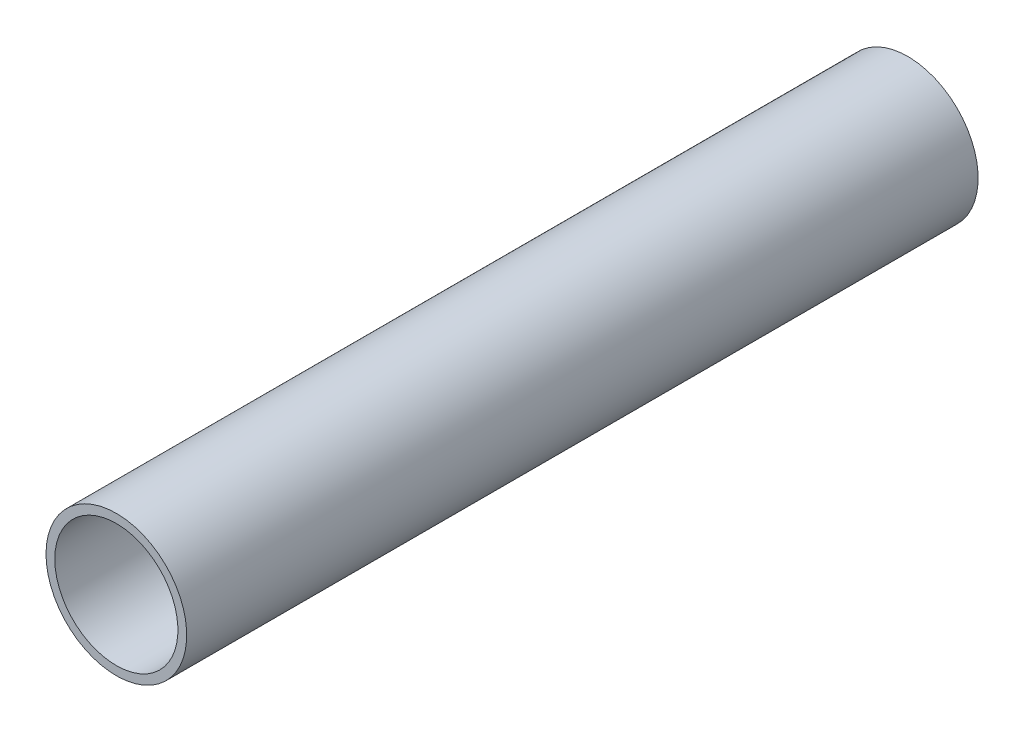
ISO-10303-21;
HEADER;
FILE_DESCRIPTION(('STEP AP214'),'2;1');
FILE_NAME('part.step','',(''),(''),'','','');
FILE_SCHEMA(('AUTOMOTIVE_DESIGN { 1 0 10303 214 1 1 1 1 }'));
ENDSEC;
DATA;
#1=APPLICATION_CONTEXT('core data for automotive mechanical design processes');
#2=APPLICATION_PROTOCOL_DEFINITION('international standard','automotive_design',2000,#1);
#3=PRODUCT_CONTEXT('',#1,'mechanical');
#4=PRODUCT('Part','Part','',(#3));
#5=PRODUCT_RELATED_PRODUCT_CATEGORY('part','',(#4));
#6=PRODUCT_DEFINITION_FORMATION('','',#4);
#7=PRODUCT_DEFINITION_CONTEXT('part definition',#1,'design');
#8=PRODUCT_DEFINITION('design','',#6,#7);
#9=PRODUCT_DEFINITION_SHAPE('','',#8);
#10=(LENGTH_UNIT() NAMED_UNIT(*) SI_UNIT(.MILLI.,.METRE.));
#11=(NAMED_UNIT(*) PLANE_ANGLE_UNIT() SI_UNIT($,.RADIAN.));
#12=(NAMED_UNIT(*) SI_UNIT($,.STERADIAN.) SOLID_ANGLE_UNIT());
#13=UNCERTAINTY_MEASURE_WITH_UNIT(LENGTH_MEASURE(1.E-05),#10,'distance_accuracy_value','');
#14=(GEOMETRIC_REPRESENTATION_CONTEXT(3) GLOBAL_UNCERTAINTY_ASSIGNED_CONTEXT((#13)) GLOBAL_UNIT_ASSIGNED_CONTEXT((#10,
#11,#12)) REPRESENTATION_CONTEXT('',''));
#15=CARTESIAN_POINT('',(0.,0.,0.));
#16=DIRECTION('',(0.,0.,1.));
#17=DIRECTION('',(1.,0.,0.));
#18=AXIS2_PLACEMENT_3D('',#15,#16,#17);
#19=CARTESIAN_POINT('',(0.,0.,90.));
#20=DIRECTION('',(0.,0.,1.));
#21=DIRECTION('',(1.,0.,0.));
#22=AXIS2_PLACEMENT_3D('',#19,#20,#21);
#23=PLANE('',#22);
#24=CARTESIAN_POINT('',(0.,0.,90.));
#25=DIRECTION('',(0.,0.,1.));
#26=DIRECTION('',(1.,0.,0.));
#27=AXIS2_PLACEMENT_3D('',#24,#25,#26);
#28=CIRCLE('',#27,8.);
#29=CARTESIAN_POINT('',(-8.,0.,90.));
#30=VERTEX_POINT('',#29);
#31=EDGE_CURVE('E10',#30,#30,#28,.T.);
#32=ORIENTED_EDGE('',*,*,#31,.T.);
#33=EDGE_LOOP('',(#32));
#34=FACE_BOUND('',#33,.T.);
#35=CARTESIAN_POINT('',(0.,0.,90.));
#36=DIRECTION('',(0.,0.,1.));
#37=DIRECTION('',(1.,0.,0.));
#38=AXIS2_PLACEMENT_3D('',#35,#36,#37);
#39=CIRCLE('',#38,7.);
#40=CARTESIAN_POINT('',(-7.,0.,90.));
#41=VERTEX_POINT('',#40);
#42=EDGE_CURVE('E50',#41,#41,#39,.T.);
#43=ORIENTED_EDGE('',*,*,#42,.F.);
#44=EDGE_LOOP('',(#43));
#45=FACE_BOUND('',#44,.T.);
#46=ADVANCED_FACE('F39',(#34,#45),#23,.T.);
#47=CARTESIAN_POINT('',(0.,0.,0.));
#48=DIRECTION('',(0.,0.,1.));
#49=DIRECTION('',(1.,0.,0.));
#50=AXIS2_PLACEMENT_3D('',#47,#48,#49);
#51=PLANE('',#50);
#52=CARTESIAN_POINT('',(0.,0.,0.));
#53=DIRECTION('',(0.,0.,1.));
#54=DIRECTION('',(1.,0.,0.));
#55=AXIS2_PLACEMENT_3D('',#52,#53,#54);
#56=CIRCLE('',#55,8.);
#57=CARTESIAN_POINT('',(-8.,0.,0.));
#58=VERTEX_POINT('',#57);
#59=EDGE_CURVE('E43',#58,#58,#56,.T.);
#60=ORIENTED_EDGE('',*,*,#59,.F.);
#61=EDGE_LOOP('',(#60));
#62=FACE_BOUND('',#61,.T.);
#63=CARTESIAN_POINT('',(0.,0.,0.));
#64=DIRECTION('',(0.,0.,1.));
#65=DIRECTION('',(1.,0.,0.));
#66=AXIS2_PLACEMENT_3D('',#63,#64,#65);
#67=CIRCLE('',#66,7.);
#68=CARTESIAN_POINT('',(-7.,0.,0.));
#69=VERTEX_POINT('',#68);
#70=EDGE_CURVE('E52',#69,#69,#67,.T.);
#71=ORIENTED_EDGE('',*,*,#70,.T.);
#72=EDGE_LOOP('',(#71));
#73=FACE_BOUND('',#72,.T.);
#74=ADVANCED_FACE('F62',(#62,#73),#51,.F.);
#75=CARTESIAN_POINT('',(0.,0.,90.));
#76=DIRECTION('',(0.,0.,-1.));
#77=DIRECTION('',(-1.,0.,0.));
#78=AXIS2_PLACEMENT_3D('',#75,#76,#77);
#79=CYLINDRICAL_SURFACE('',#78,8.);
#80=CARTESIAN_POINT('',(-8.,0.,90.));
#81=CARTESIAN_POINT('',(-8.,0.,89.0625));
#82=CARTESIAN_POINT('',(-8.,0.,88.125));
#83=CARTESIAN_POINT('',(-8.,0.,86.25));
#84=CARTESIAN_POINT('',(-8.,0.,85.3125));
#85=CARTESIAN_POINT('',(-8.,0.,83.4375));
#86=CARTESIAN_POINT('',(-8.,0.,82.5));
#87=CARTESIAN_POINT('',(-8.,0.,80.625));
#88=CARTESIAN_POINT('',(-8.,0.,79.6875));
#89=CARTESIAN_POINT('',(-8.,0.,77.8125));
#90=CARTESIAN_POINT('',(-8.,0.,76.875));
#91=CARTESIAN_POINT('',(-8.,0.,75.));
#92=CARTESIAN_POINT('',(-8.,0.,74.0625));
#93=CARTESIAN_POINT('',(-8.,0.,72.1875));
#94=CARTESIAN_POINT('',(-8.,0.,71.25));
#95=CARTESIAN_POINT('',(-8.,0.,69.375));
#96=CARTESIAN_POINT('',(-8.,0.,68.4375));
#97=CARTESIAN_POINT('',(-8.,0.,66.5625));
#98=CARTESIAN_POINT('',(-8.,0.,65.625));
#99=CARTESIAN_POINT('',(-8.,0.,63.75));
#100=CARTESIAN_POINT('',(-8.,0.,62.8125));
#101=CARTESIAN_POINT('',(-8.,0.,60.9375));
#102=CARTESIAN_POINT('',(-8.,0.,60.));
#103=CARTESIAN_POINT('',(-8.,0.,58.125));
#104=CARTESIAN_POINT('',(-8.,0.,57.1875));
#105=CARTESIAN_POINT('',(-8.,0.,55.3125));
#106=CARTESIAN_POINT('',(-8.,0.,54.375));
#107=CARTESIAN_POINT('',(-8.,0.,52.5));
#108=CARTESIAN_POINT('',(-8.,0.,51.5625));
#109=CARTESIAN_POINT('',(-8.,0.,49.6875));
#110=CARTESIAN_POINT('',(-8.,0.,48.75));
#111=CARTESIAN_POINT('',(-8.,0.,46.875));
#112=CARTESIAN_POINT('',(-8.,0.,45.9375));
#113=CARTESIAN_POINT('',(-8.,0.,44.0625));
#114=CARTESIAN_POINT('',(-8.,0.,43.125));
#115=CARTESIAN_POINT('',(-8.,0.,41.25));
#116=CARTESIAN_POINT('',(-8.,0.,40.3125));
#117=CARTESIAN_POINT('',(-8.,0.,38.4375));
#118=CARTESIAN_POINT('',(-8.,0.,37.5));
#119=CARTESIAN_POINT('',(-8.,0.,35.625));
#120=CARTESIAN_POINT('',(-8.,0.,34.6875));
#121=CARTESIAN_POINT('',(-8.,0.,32.8125));
#122=CARTESIAN_POINT('',(-8.,0.,31.875));
#123=CARTESIAN_POINT('',(-8.,0.,30.));
#124=CARTESIAN_POINT('',(-8.,0.,29.0625));
#125=CARTESIAN_POINT('',(-8.,0.,27.1875));
#126=CARTESIAN_POINT('',(-8.,0.,26.25));
#127=CARTESIAN_POINT('',(-8.,0.,24.375));
#128=CARTESIAN_POINT('',(-8.,0.,23.4375));
#129=CARTESIAN_POINT('',(-8.,0.,21.5625));
#130=CARTESIAN_POINT('',(-8.,0.,20.625));
#131=CARTESIAN_POINT('',(-8.,0.,18.75));
#132=CARTESIAN_POINT('',(-8.,0.,17.8125));
#133=CARTESIAN_POINT('',(-8.,0.,15.9375));
#134=CARTESIAN_POINT('',(-8.,0.,15.));
#135=CARTESIAN_POINT('',(-8.,0.,13.125));
#136=CARTESIAN_POINT('',(-8.,0.,12.1875));
#137=CARTESIAN_POINT('',(-8.,0.,10.3125));
#138=CARTESIAN_POINT('',(-8.,0.,9.37499999999999));
#139=CARTESIAN_POINT('',(-8.,0.,7.49999999999999));
#140=CARTESIAN_POINT('',(-8.,0.,6.56249999999999));
#141=CARTESIAN_POINT('',(-8.,0.,4.68749999999999));
#142=CARTESIAN_POINT('',(-8.,0.,3.74999999999998));
#143=CARTESIAN_POINT('',(-8.,0.,1.87499999999998));
#144=CARTESIAN_POINT('',(-8.,0.,0.937499999999986));
#145=CARTESIAN_POINT('',(-8.,0.,0.));
#146=B_SPLINE_CURVE_WITH_KNOTS('',3,(#80,#81,#82,#83,#84,#85,#86,#87,#88,#89,#90,#91,#92,#93,
#94,#95,#96,#97,#98,#99,#100,#101,#102,#103,#104,#105,#106,#107,#108,#109,#110,#111,#112,#113,
#114,#115,#116,#117,#118,#119,#120,#121,#122,#123,#124,#125,#126,#127,#128,#129,#130,#131,#132,
#133,#134,#135,#136,#137,#138,#139,#140,#141,#142,#143,#144,#145),.UNSPECIFIED.,.F.,.F.,(4,2,2,
2,2,2,2,2,2,2,2,2,2,2,2,2,2,2,2,2,2,2,2,2,2,2,2,2,2,2,2,2,4),(0.,2.8125,5.62499999999999,
8.43749999999999,11.25,14.0625,16.875,19.6875,22.5,25.3125,28.125,30.9375,33.75,36.5625,39.375,
42.1875,45.,47.8125,50.625,53.4375,56.25,59.0625,61.875,64.6875,67.5,70.3125,73.125,75.9375,
78.75,81.5625,84.375,87.1875,90.),.UNSPECIFIED.);
#147=EDGE_CURVE('BSEAM41',#30,#58,#146,.T.);
#148=ORIENTED_EDGE('',*,*,#31,.F.);
#149=ORIENTED_EDGE('',*,*,#59,.T.);
#150=ORIENTED_EDGE('',*,*,#147,.T.);
#151=ORIENTED_EDGE('',*,*,#147,.F.);
#152=EDGE_LOOP('',(#148,#150,#149,#151));
#153=FACE_BOUND('',#152,.T.);
#154=ADVANCED_FACE('F41',(#153),#79,.T.);
#155=CARTESIAN_POINT('',(0.,0.,90.));
#156=DIRECTION('',(0.,0.,-1.));
#157=DIRECTION('',(-1.,0.,0.));
#158=AXIS2_PLACEMENT_3D('',#155,#156,#157);
#159=CYLINDRICAL_SURFACE('',#158,7.);
#160=CARTESIAN_POINT('',(-7.,0.,90.));
#161=CARTESIAN_POINT('',(-7.,0.,89.0625));
#162=CARTESIAN_POINT('',(-7.,0.,88.125));
#163=CARTESIAN_POINT('',(-7.,0.,86.25));
#164=CARTESIAN_POINT('',(-7.,0.,85.3125));
#165=CARTESIAN_POINT('',(-7.,0.,83.4375));
#166=CARTESIAN_POINT('',(-7.,0.,82.5));
#167=CARTESIAN_POINT('',(-7.,0.,80.625));
#168=CARTESIAN_POINT('',(-7.,0.,79.6875));
#169=CARTESIAN_POINT('',(-7.,0.,77.8125));
#170=CARTESIAN_POINT('',(-7.,0.,76.875));
#171=CARTESIAN_POINT('',(-7.,0.,75.));
#172=CARTESIAN_POINT('',(-7.,0.,74.0625));
#173=CARTESIAN_POINT('',(-7.,0.,72.1875));
#174=CARTESIAN_POINT('',(-7.,0.,71.25));
#175=CARTESIAN_POINT('',(-7.,0.,69.375));
#176=CARTESIAN_POINT('',(-7.,0.,68.4375));
#177=CARTESIAN_POINT('',(-7.,0.,66.5625));
#178=CARTESIAN_POINT('',(-7.,0.,65.625));
#179=CARTESIAN_POINT('',(-7.,0.,63.75));
#180=CARTESIAN_POINT('',(-7.,0.,62.8125));
#181=CARTESIAN_POINT('',(-7.,0.,60.9375));
#182=CARTESIAN_POINT('',(-7.,0.,60.));
#183=CARTESIAN_POINT('',(-7.,0.,58.125));
#184=CARTESIAN_POINT('',(-7.,0.,57.1875));
#185=CARTESIAN_POINT('',(-7.,0.,55.3125));
#186=CARTESIAN_POINT('',(-7.,0.,54.375));
#187=CARTESIAN_POINT('',(-7.,0.,52.5));
#188=CARTESIAN_POINT('',(-7.,0.,51.5625));
#189=CARTESIAN_POINT('',(-7.,0.,49.6875));
#190=CARTESIAN_POINT('',(-7.,0.,48.75));
#191=CARTESIAN_POINT('',(-7.,0.,46.875));
#192=CARTESIAN_POINT('',(-7.,0.,45.9375));
#193=CARTESIAN_POINT('',(-7.,0.,44.0625));
#194=CARTESIAN_POINT('',(-7.,0.,43.125));
#195=CARTESIAN_POINT('',(-7.,0.,41.25));
#196=CARTESIAN_POINT('',(-7.,0.,40.3125));
#197=CARTESIAN_POINT('',(-7.,0.,38.4375));
#198=CARTESIAN_POINT('',(-7.,0.,37.5));
#199=CARTESIAN_POINT('',(-7.,0.,35.625));
#200=CARTESIAN_POINT('',(-7.,0.,34.6875));
#201=CARTESIAN_POINT('',(-7.,0.,32.8125));
#202=CARTESIAN_POINT('',(-7.,0.,31.875));
#203=CARTESIAN_POINT('',(-7.,0.,30.));
#204=CARTESIAN_POINT('',(-7.,0.,29.0625));
#205=CARTESIAN_POINT('',(-7.,0.,27.1875));
#206=CARTESIAN_POINT('',(-7.,0.,26.25));
#207=CARTESIAN_POINT('',(-7.,0.,24.375));
#208=CARTESIAN_POINT('',(-7.,0.,23.4375));
#209=CARTESIAN_POINT('',(-7.,0.,21.5625));
#210=CARTESIAN_POINT('',(-7.,0.,20.625));
#211=CARTESIAN_POINT('',(-7.,0.,18.75));
#212=CARTESIAN_POINT('',(-7.,0.,17.8125));
#213=CARTESIAN_POINT('',(-7.,0.,15.9375));
#214=CARTESIAN_POINT('',(-7.,0.,15.));
#215=CARTESIAN_POINT('',(-7.,0.,13.125));
#216=CARTESIAN_POINT('',(-7.,0.,12.1875));
#217=CARTESIAN_POINT('',(-7.,0.,10.3125));
#218=CARTESIAN_POINT('',(-7.,0.,9.37499999999999));
#219=CARTESIAN_POINT('',(-7.,0.,7.49999999999999));
#220=CARTESIAN_POINT('',(-7.,0.,6.56249999999999));
#221=CARTESIAN_POINT('',(-7.,0.,4.68749999999999));
#222=CARTESIAN_POINT('',(-7.,0.,3.74999999999998));
#223=CARTESIAN_POINT('',(-7.,0.,1.87499999999998));
#224=CARTESIAN_POINT('',(-7.,0.,0.937499999999986));
#225=CARTESIAN_POINT('',(-7.,0.,0.));
#226=B_SPLINE_CURVE_WITH_KNOTS('',3,(#160,#161,#162,#163,#164,#165,#166,#167,#168,#169,#170,
#171,#172,#173,#174,#175,#176,#177,#178,#179,#180,#181,#182,#183,#184,#185,#186,#187,#188,#189,
#190,#191,#192,#193,#194,#195,#196,#197,#198,#199,#200,#201,#202,#203,#204,#205,#206,#207,#208,
#209,#210,#211,#212,#213,#214,#215,#216,#217,#218,#219,#220,#221,#222,#223,#224,#225),
.UNSPECIFIED.,.F.,.F.,(4,2,2,2,2,2,2,2,2,2,2,2,2,2,2,2,2,2,2,2,2,2,2,2,2,2,2,2,2,2,2,2,4),(0.,
2.81250000000001,5.62500000000001,8.43750000000001,11.25,14.0625,16.875,19.6875,22.5,25.3125,
28.125,30.9375,33.75,36.5625,39.375,42.1875,45.,47.8125,50.625,53.4375,56.25,59.0625,61.875,
64.6875,67.5,70.3125,73.125,75.9375,78.75,81.5625,84.375,87.1875,90.),.UNSPECIFIED.);
#227=EDGE_CURVE('BSEAM58',#41,#69,#226,.T.);
#228=ORIENTED_EDGE('',*,*,#42,.T.);
#229=ORIENTED_EDGE('',*,*,#70,.F.);
#230=ORIENTED_EDGE('',*,*,#227,.T.);
#231=ORIENTED_EDGE('',*,*,#227,.F.);
#232=EDGE_LOOP('',(#228,#230,#229,#231));
#233=FACE_BOUND('',#232,.T.);
#234=ADVANCED_FACE('F58',(#233),#159,.F.);
#235=CLOSED_SHELL('',(#46,#74,#154,#234));
#236=MANIFOLD_SOLID_BREP('B2',#235);
#237=ADVANCED_BREP_SHAPE_REPRESENTATION('',(#18,#236),#14);
#238=SHAPE_DEFINITION_REPRESENTATION(#9,#237);
ENDSEC;
END-ISO-10303-21;
